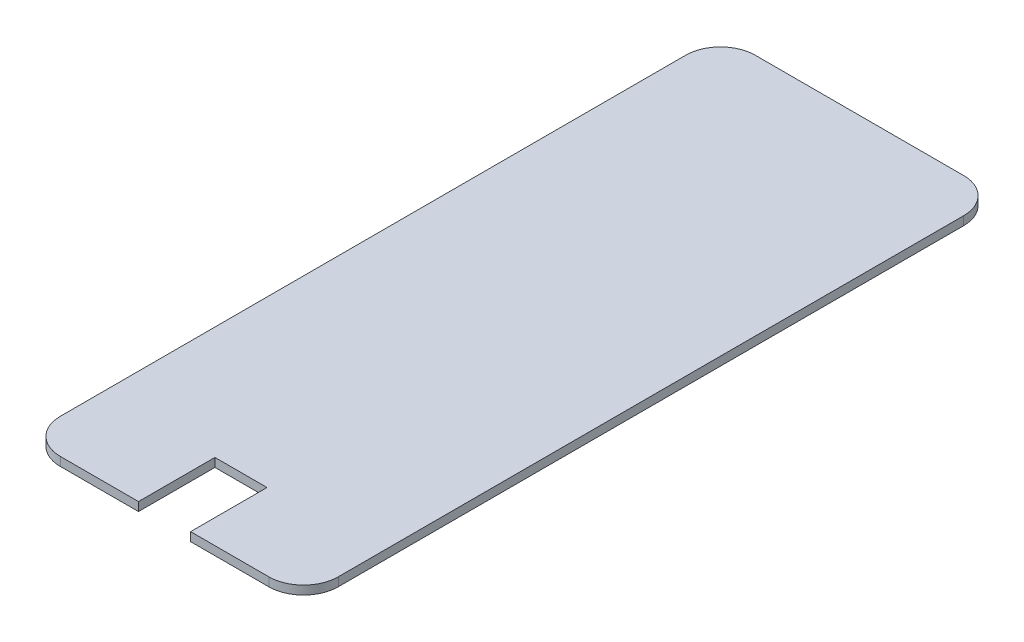
ISO-10303-21;
HEADER;
FILE_DESCRIPTION(('STEP AP214'),'2;1');
FILE_NAME('part.step','',(''),(''),'','','');
FILE_SCHEMA(('AUTOMOTIVE_DESIGN { 1 0 10303 214 1 1 1 1 }'));
ENDSEC;
DATA;
#1=APPLICATION_CONTEXT('core data for automotive mechanical design processes');
#2=APPLICATION_PROTOCOL_DEFINITION('international standard','automotive_design',2000,#1);
#3=PRODUCT_CONTEXT('',#1,'mechanical');
#4=PRODUCT('Part','Part','',(#3));
#5=PRODUCT_RELATED_PRODUCT_CATEGORY('part','',(#4));
#6=PRODUCT_DEFINITION_FORMATION('','',#4);
#7=PRODUCT_DEFINITION_CONTEXT('part definition',#1,'design');
#8=PRODUCT_DEFINITION('design','',#6,#7);
#9=PRODUCT_DEFINITION_SHAPE('','',#8);
#10=(LENGTH_UNIT() NAMED_UNIT(*) SI_UNIT(.MILLI.,.METRE.));
#11=(NAMED_UNIT(*) PLANE_ANGLE_UNIT() SI_UNIT($,.RADIAN.));
#12=(NAMED_UNIT(*) SI_UNIT($,.STERADIAN.) SOLID_ANGLE_UNIT());
#13=UNCERTAINTY_MEASURE_WITH_UNIT(LENGTH_MEASURE(1.E-05),#10,'distance_accuracy_value','');
#14=(GEOMETRIC_REPRESENTATION_CONTEXT(3) GLOBAL_UNCERTAINTY_ASSIGNED_CONTEXT((#13)) GLOBAL_UNIT_ASSIGNED_CONTEXT((#10,
#11,#12)) REPRESENTATION_CONTEXT('',''));
#15=CARTESIAN_POINT('',(0.,0.,0.));
#16=DIRECTION('',(0.,0.,1.));
#17=DIRECTION('',(1.,0.,0.));
#18=AXIS2_PLACEMENT_3D('',#15,#16,#17);
#19=CARTESIAN_POINT('',(-50.8,3.175,127.));
#20=DIRECTION('',(0.,0.,-1.));
#21=DIRECTION('',(-1.,0.,0.));
#22=AXIS2_PLACEMENT_3D('',#19,#20,#21);
#23=PLANE('',#22);
#24=DIRECTION('',(1.,0.,0.));
#25=VECTOR('',#24,1.);
#26=CARTESIAN_POINT('',(-50.8,3.175,127.));
#27=LINE('',#26,#25);
#28=CARTESIAN_POINT('',(9.525,3.175,127.));
#29=VERTEX_POINT('',#28);
#30=CARTESIAN_POINT('',(38.1,3.175,127.));
#31=VERTEX_POINT('',#30);
#32=EDGE_CURVE('E163',#29,#31,#27,.T.);
#33=ORIENTED_EDGE('',*,*,#32,.F.);
#34=DIRECTION('',(0.,1.,0.));
#35=VECTOR('',#34,1.);
#36=CARTESIAN_POINT('',(9.525,0.,127.));
#37=LINE('',#36,#35);
#38=CARTESIAN_POINT('',(9.525,0.,127.));
#39=VERTEX_POINT('',#38);
#40=EDGE_CURVE('E153',#39,#29,#37,.T.);
#41=ORIENTED_EDGE('',*,*,#40,.F.);
#42=DIRECTION('',(1.,0.,0.));
#43=VECTOR('',#42,1.);
#44=CARTESIAN_POINT('',(-50.8,0.,127.));
#45=LINE('',#44,#43);
#46=CARTESIAN_POINT('',(38.1,0.,127.));
#47=VERTEX_POINT('',#46);
#48=EDGE_CURVE('E144',#39,#47,#45,.T.);
#49=ORIENTED_EDGE('',*,*,#48,.T.);
#50=DIRECTION('',(0.,-1.,0.));
#51=VECTOR('',#50,1.);
#52=CARTESIAN_POINT('',(38.1,3.175,127.));
#53=LINE('',#52,#51);
#54=EDGE_CURVE('E173',#47,#31,#53,.F.);
#55=ORIENTED_EDGE('',*,*,#54,.T.);
#56=EDGE_LOOP('',(#33,#41,#49,#55));
#57=FACE_BOUND('',#56,.T.);
#58=ADVANCED_FACE('F34',(#57),#23,.F.);
#59=CARTESIAN_POINT('',(-50.8,3.175,-127.));
#60=DIRECTION('',(1.,0.,0.));
#61=DIRECTION('',(0.,0.,-1.));
#62=AXIS2_PLACEMENT_3D('',#59,#60,#61);
#63=PLANE('',#62);
#64=DIRECTION('',(0.,0.,1.));
#65=VECTOR('',#64,1.);
#66=CARTESIAN_POINT('',(-50.8,0.,-127.));
#67=LINE('',#66,#65);
#68=CARTESIAN_POINT('',(-50.8,0.,-114.3));
#69=VERTEX_POINT('',#68);
#70=CARTESIAN_POINT('',(-50.8,0.,114.3));
#71=VERTEX_POINT('',#70);
#72=EDGE_CURVE('E155',#69,#71,#67,.T.);
#73=ORIENTED_EDGE('',*,*,#72,.T.);
#74=DIRECTION('',(0.,-1.,0.));
#75=VECTOR('',#74,1.);
#76=CARTESIAN_POINT('',(-50.8,3.175,114.3));
#77=LINE('',#76,#75);
#78=CARTESIAN_POINT('',(-50.8,3.175,114.3));
#79=VERTEX_POINT('',#78);
#80=EDGE_CURVE('E199',#71,#79,#77,.F.);
#81=ORIENTED_EDGE('',*,*,#80,.T.);
#82=DIRECTION('',(0.,0.,1.));
#83=VECTOR('',#82,1.);
#84=CARTESIAN_POINT('',(-50.8,3.175,-127.));
#85=LINE('',#84,#83);
#86=CARTESIAN_POINT('',(-50.8,3.175,-114.3));
#87=VERTEX_POINT('',#86);
#88=EDGE_CURVE('E160',#87,#79,#85,.T.);
#89=ORIENTED_EDGE('',*,*,#88,.F.);
#90=DIRECTION('',(0.,-1.,0.));
#91=VECTOR('',#90,1.);
#92=CARTESIAN_POINT('',(-50.8,3.175,-114.3));
#93=LINE('',#92,#91);
#94=EDGE_CURVE('E196',#87,#69,#93,.T.);
#95=ORIENTED_EDGE('',*,*,#94,.T.);
#96=EDGE_LOOP('',(#73,#81,#89,#95));
#97=FACE_BOUND('',#96,.T.);
#98=ADVANCED_FACE('F236',(#97),#63,.F.);
#99=CARTESIAN_POINT('',(-38.1,0.,127.));
#100=VERTEX_POINT('',#99);
#101=CARTESIAN_POINT('',(-9.525,0.,127.));
#102=VERTEX_POINT('',#101);
#103=EDGE_CURVE('E176',#100,#102,#45,.T.);
#104=ORIENTED_EDGE('',*,*,#103,.T.);
#105=DIRECTION('',(0.,1.,0.));
#106=VECTOR('',#105,1.);
#107=CARTESIAN_POINT('',(-9.525,0.,127.));
#108=LINE('',#107,#106);
#109=CARTESIAN_POINT('',(-9.525,3.175,127.));
#110=VERTEX_POINT('',#109);
#111=EDGE_CURVE('E156',#102,#110,#108,.T.);
#112=ORIENTED_EDGE('',*,*,#111,.T.);
#113=CARTESIAN_POINT('',(-38.1,3.175,127.));
#114=VERTEX_POINT('',#113);
#115=EDGE_CURVE('E165',#114,#110,#27,.T.);
#116=ORIENTED_EDGE('',*,*,#115,.F.);
#117=DIRECTION('',(0.,-1.,0.));
#118=VECTOR('',#117,1.);
#119=CARTESIAN_POINT('',(-38.1,3.175,127.));
#120=LINE('',#119,#118);
#121=EDGE_CURVE('E185',#114,#100,#120,.T.);
#122=ORIENTED_EDGE('',*,*,#121,.T.);
#123=EDGE_LOOP('',(#104,#112,#116,#122));
#124=FACE_BOUND('',#123,.T.);
#125=ADVANCED_FACE('F245',(#124),#23,.F.);
#126=CARTESIAN_POINT('',(50.8,3.175,-127.));
#127=DIRECTION('',(-1.,0.,0.));
#128=DIRECTION('',(0.,0.,1.));
#129=AXIS2_PLACEMENT_3D('',#126,#127,#128);
#130=PLANE('',#129);
#131=DIRECTION('',(0.,0.,-1.));
#132=VECTOR('',#131,1.);
#133=CARTESIAN_POINT('',(50.8,3.175,-127.));
#134=LINE('',#133,#132);
#135=CARTESIAN_POINT('',(50.8,3.175,114.3));
#136=VERTEX_POINT('',#135);
#137=CARTESIAN_POINT('',(50.8,3.175,-114.3));
#138=VERTEX_POINT('',#137);
#139=EDGE_CURVE('E168',#136,#138,#134,.T.);
#140=ORIENTED_EDGE('',*,*,#139,.F.);
#141=DIRECTION('',(0.,-1.,0.));
#142=VECTOR('',#141,1.);
#143=CARTESIAN_POINT('',(50.8,3.175,114.3));
#144=LINE('',#143,#142);
#145=CARTESIAN_POINT('',(50.8,0.,114.3));
#146=VERTEX_POINT('',#145);
#147=EDGE_CURVE('E211',#136,#146,#144,.T.);
#148=ORIENTED_EDGE('',*,*,#147,.T.);
#149=DIRECTION('',(0.,0.,-1.));
#150=VECTOR('',#149,1.);
#151=CARTESIAN_POINT('',(50.8,0.,-127.));
#152=LINE('',#151,#150);
#153=CARTESIAN_POINT('',(50.8,0.,-114.3));
#154=VERTEX_POINT('',#153);
#155=EDGE_CURVE('E179',#146,#154,#152,.T.);
#156=ORIENTED_EDGE('',*,*,#155,.T.);
#157=DIRECTION('',(0.,-1.,0.));
#158=VECTOR('',#157,1.);
#159=CARTESIAN_POINT('',(50.8,3.175,-114.3));
#160=LINE('',#159,#158);
#161=EDGE_CURVE('E209',#154,#138,#160,.F.);
#162=ORIENTED_EDGE('',*,*,#161,.T.);
#163=EDGE_LOOP('',(#140,#148,#156,#162));
#164=FACE_BOUND('',#163,.T.);
#165=ADVANCED_FACE('F217',(#164),#130,.F.);
#166=CARTESIAN_POINT('',(-50.8,3.175,-127.));
#167=DIRECTION('',(0.,0.,1.));
#168=DIRECTION('',(1.,0.,0.));
#169=AXIS2_PLACEMENT_3D('',#166,#167,#168);
#170=PLANE('',#169);
#171=DIRECTION('',(-1.,0.,0.));
#172=VECTOR('',#171,1.);
#173=CARTESIAN_POINT('',(-50.8,3.175,-127.));
#174=LINE('',#173,#172);
#175=CARTESIAN_POINT('',(38.1,3.175,-127.));
#176=VERTEX_POINT('',#175);
#177=CARTESIAN_POINT('',(-38.1,3.175,-127.));
#178=VERTEX_POINT('',#177);
#179=EDGE_CURVE('E171',#176,#178,#174,.T.);
#180=ORIENTED_EDGE('',*,*,#179,.F.);
#181=DIRECTION('',(0.,-1.,0.));
#182=VECTOR('',#181,1.);
#183=CARTESIAN_POINT('',(38.1,3.175,-127.));
#184=LINE('',#183,#182);
#185=CARTESIAN_POINT('',(38.1,0.,-127.));
#186=VERTEX_POINT('',#185);
#187=EDGE_CURVE('E11',#176,#186,#184,.T.);
#188=ORIENTED_EDGE('',*,*,#187,.T.);
#189=DIRECTION('',(-1.,0.,0.));
#190=VECTOR('',#189,1.);
#191=CARTESIAN_POINT('',(-50.8,0.,-127.));
#192=LINE('',#191,#190);
#193=CARTESIAN_POINT('',(-38.1,0.,-127.));
#194=VERTEX_POINT('',#193);
#195=EDGE_CURVE('E164',#186,#194,#192,.T.);
#196=ORIENTED_EDGE('',*,*,#195,.T.);
#197=DIRECTION('',(0.,-1.,0.));
#198=VECTOR('',#197,1.);
#199=CARTESIAN_POINT('',(-38.1,3.175,-127.));
#200=LINE('',#199,#198);
#201=EDGE_CURVE('E42',#194,#178,#200,.F.);
#202=ORIENTED_EDGE('',*,*,#201,.T.);
#203=EDGE_LOOP('',(#180,#188,#196,#202));
#204=FACE_BOUND('',#203,.T.);
#205=ADVANCED_FACE('F227',(#204),#170,.F.);
#206=CARTESIAN_POINT('',(0.,3.175,0.));
#207=DIRECTION('',(0.,1.,0.));
#208=DIRECTION('',(0.,0.,1.));
#209=AXIS2_PLACEMENT_3D('',#206,#207,#208);
#210=PLANE('',#209);
#211=DIRECTION('',(0.,0.,-1.));
#212=VECTOR('',#211,1.);
#213=CARTESIAN_POINT('',(9.525,3.175,99.06));
#214=LINE('',#213,#212);
#215=CARTESIAN_POINT('',(9.525,3.175,99.06));
#216=VERTEX_POINT('',#215);
#217=EDGE_CURVE('E130',#29,#216,#214,.T.);
#218=ORIENTED_EDGE('',*,*,#217,.F.);
#219=ORIENTED_EDGE('',*,*,#32,.T.);
#220=CARTESIAN_POINT('',(38.1,3.175,114.3));
#221=DIRECTION('',(0.,1.,0.));
#222=DIRECTION('',(0.,0.,1.));
#223=AXIS2_PLACEMENT_3D('',#220,#221,#222);
#224=CIRCLE('',#223,12.7);
#225=EDGE_CURVE('E205',#31,#136,#224,.T.);
#226=ORIENTED_EDGE('',*,*,#225,.T.);
#227=ORIENTED_EDGE('',*,*,#139,.T.);
#228=CARTESIAN_POINT('',(38.1,3.175,-114.3));
#229=DIRECTION('',(0.,1.,0.));
#230=DIRECTION('',(0.,0.,1.));
#231=AXIS2_PLACEMENT_3D('',#228,#229,#230);
#232=CIRCLE('',#231,12.7);
#233=EDGE_CURVE('E203',#138,#176,#232,.T.);
#234=ORIENTED_EDGE('',*,*,#233,.T.);
#235=ORIENTED_EDGE('',*,*,#179,.T.);
#236=CARTESIAN_POINT('',(-38.1,3.175,-114.3));
#237=DIRECTION('',(0.,1.,0.));
#238=DIRECTION('',(0.,0.,1.));
#239=AXIS2_PLACEMENT_3D('',#236,#237,#238);
#240=CIRCLE('',#239,12.7);
#241=EDGE_CURVE('E201',#178,#87,#240,.T.);
#242=ORIENTED_EDGE('',*,*,#241,.T.);
#243=ORIENTED_EDGE('',*,*,#88,.T.);
#244=CARTESIAN_POINT('',(-38.1,3.175,114.3));
#245=DIRECTION('',(0.,1.,0.));
#246=DIRECTION('',(0.,0.,1.));
#247=AXIS2_PLACEMENT_3D('',#244,#245,#246);
#248=CIRCLE('',#247,12.7);
#249=EDGE_CURVE('E207',#79,#114,#248,.T.);
#250=ORIENTED_EDGE('',*,*,#249,.T.);
#251=ORIENTED_EDGE('',*,*,#115,.T.);
#252=DIRECTION('',(0.,0.,1.));
#253=VECTOR('',#252,1.);
#254=CARTESIAN_POINT('',(-9.525,3.175,99.06));
#255=LINE('',#254,#253);
#256=CARTESIAN_POINT('',(-9.525,3.175,99.06));
#257=VERTEX_POINT('',#256);
#258=EDGE_CURVE('E145',#257,#110,#255,.T.);
#259=ORIENTED_EDGE('',*,*,#258,.F.);
#260=DIRECTION('',(-1.,0.,0.));
#261=VECTOR('',#260,1.);
#262=CARTESIAN_POINT('',(-9.525,3.175,99.06));
#263=LINE('',#262,#261);
#264=EDGE_CURVE('E147',#216,#257,#263,.T.);
#265=ORIENTED_EDGE('',*,*,#264,.F.);
#266=EDGE_LOOP('',(#218,#219,#226,#227,#234,#235,#242,#243,#250,#251,#259,#265));
#267=FACE_BOUND('',#266,.T.);
#268=ADVANCED_FACE('F230',(#267),#210,.T.);
#269=CARTESIAN_POINT('',(0.,0.,0.));
#270=DIRECTION('',(0.,1.,0.));
#271=DIRECTION('',(0.,0.,1.));
#272=AXIS2_PLACEMENT_3D('',#269,#270,#271);
#273=PLANE('',#272);
#274=ORIENTED_EDGE('',*,*,#48,.F.);
#275=DIRECTION('',(0.,0.,-1.));
#276=VECTOR('',#275,1.);
#277=CARTESIAN_POINT('',(9.525,0.,99.06));
#278=LINE('',#277,#276);
#279=CARTESIAN_POINT('',(9.525,0.,99.06));
#280=VERTEX_POINT('',#279);
#281=EDGE_CURVE('E127',#39,#280,#278,.T.);
#282=ORIENTED_EDGE('',*,*,#281,.T.);
#283=DIRECTION('',(-1.,0.,0.));
#284=VECTOR('',#283,1.);
#285=CARTESIAN_POINT('',(-9.525,0.,99.06));
#286=LINE('',#285,#284);
#287=CARTESIAN_POINT('',(-9.525,0.,99.06));
#288=VERTEX_POINT('',#287);
#289=EDGE_CURVE('E137',#280,#288,#286,.T.);
#290=ORIENTED_EDGE('',*,*,#289,.T.);
#291=DIRECTION('',(0.,0.,1.));
#292=VECTOR('',#291,1.);
#293=CARTESIAN_POINT('',(-9.525,0.,99.06));
#294=LINE('',#293,#292);
#295=EDGE_CURVE('E49',#288,#102,#294,.T.);
#296=ORIENTED_EDGE('',*,*,#295,.T.);
#297=ORIENTED_EDGE('',*,*,#103,.F.);
#298=CARTESIAN_POINT('',(-38.1,0.,114.3));
#299=DIRECTION('',(0.,1.,0.));
#300=DIRECTION('',(0.,0.,1.));
#301=AXIS2_PLACEMENT_3D('',#298,#299,#300);
#302=CIRCLE('',#301,12.7);
#303=EDGE_CURVE('E194',#100,#71,#302,.F.);
#304=ORIENTED_EDGE('',*,*,#303,.T.);
#305=ORIENTED_EDGE('',*,*,#72,.F.);
#306=CARTESIAN_POINT('',(-38.1,0.,-114.3));
#307=DIRECTION('',(0.,1.,0.));
#308=DIRECTION('',(0.,0.,1.));
#309=AXIS2_PLACEMENT_3D('',#306,#307,#308);
#310=CIRCLE('',#309,12.7);
#311=EDGE_CURVE('E188',#69,#194,#310,.F.);
#312=ORIENTED_EDGE('',*,*,#311,.T.);
#313=ORIENTED_EDGE('',*,*,#195,.F.);
#314=CARTESIAN_POINT('',(38.1,0.,-114.3));
#315=DIRECTION('',(0.,1.,0.));
#316=DIRECTION('',(0.,0.,1.));
#317=AXIS2_PLACEMENT_3D('',#314,#315,#316);
#318=CIRCLE('',#317,12.7);
#319=EDGE_CURVE('E190',#186,#154,#318,.F.);
#320=ORIENTED_EDGE('',*,*,#319,.T.);
#321=ORIENTED_EDGE('',*,*,#155,.F.);
#322=CARTESIAN_POINT('',(38.1,0.,114.3));
#323=DIRECTION('',(0.,1.,0.));
#324=DIRECTION('',(0.,0.,1.));
#325=AXIS2_PLACEMENT_3D('',#322,#323,#324);
#326=CIRCLE('',#325,12.7);
#327=EDGE_CURVE('E192',#146,#47,#326,.F.);
#328=ORIENTED_EDGE('',*,*,#327,.T.);
#329=EDGE_LOOP('',(#274,#282,#290,#296,#297,#304,#305,#312,#313,#320,#321,#328));
#330=FACE_BOUND('',#329,.T.);
#331=ADVANCED_FACE('F142',(#330),#273,.F.);
#332=CARTESIAN_POINT('',(-38.1,3.175,114.3));
#333=DIRECTION('',(0.,-1.,0.));
#334=DIRECTION('',(0.,0.,-1.));
#335=AXIS2_PLACEMENT_3D('',#332,#333,#334);
#336=CYLINDRICAL_SURFACE('',#335,12.7);
#337=ORIENTED_EDGE('',*,*,#249,.F.);
#338=ORIENTED_EDGE('',*,*,#80,.F.);
#339=ORIENTED_EDGE('',*,*,#303,.F.);
#340=ORIENTED_EDGE('',*,*,#121,.F.);
#341=EDGE_LOOP('',(#337,#338,#339,#340));
#342=FACE_BOUND('',#341,.T.);
#343=ADVANCED_FACE('F242',(#342),#336,.T.);
#344=CARTESIAN_POINT('',(38.1,3.175,114.3));
#345=DIRECTION('',(0.,-1.,0.));
#346=DIRECTION('',(0.,0.,-1.));
#347=AXIS2_PLACEMENT_3D('',#344,#345,#346);
#348=CYLINDRICAL_SURFACE('',#347,12.7);
#349=ORIENTED_EDGE('',*,*,#225,.F.);
#350=ORIENTED_EDGE('',*,*,#54,.F.);
#351=ORIENTED_EDGE('',*,*,#327,.F.);
#352=ORIENTED_EDGE('',*,*,#147,.F.);
#353=EDGE_LOOP('',(#349,#350,#351,#352));
#354=FACE_BOUND('',#353,.T.);
#355=ADVANCED_FACE('F315',(#354),#348,.T.);
#356=CARTESIAN_POINT('',(38.1,3.175,-114.3));
#357=DIRECTION('',(0.,-1.,0.));
#358=DIRECTION('',(0.,0.,-1.));
#359=AXIS2_PLACEMENT_3D('',#356,#357,#358);
#360=CYLINDRICAL_SURFACE('',#359,12.7);
#361=ORIENTED_EDGE('',*,*,#233,.F.);
#362=ORIENTED_EDGE('',*,*,#161,.F.);
#363=ORIENTED_EDGE('',*,*,#319,.F.);
#364=ORIENTED_EDGE('',*,*,#187,.F.);
#365=EDGE_LOOP('',(#361,#362,#363,#364));
#366=FACE_BOUND('',#365,.T.);
#367=ADVANCED_FACE('F226',(#366),#360,.T.);
#368=CARTESIAN_POINT('',(-38.1,3.175,-114.3));
#369=DIRECTION('',(0.,-1.,0.));
#370=DIRECTION('',(0.,0.,-1.));
#371=AXIS2_PLACEMENT_3D('',#368,#369,#370);
#372=CYLINDRICAL_SURFACE('',#371,12.7);
#373=ORIENTED_EDGE('',*,*,#241,.F.);
#374=ORIENTED_EDGE('',*,*,#201,.F.);
#375=ORIENTED_EDGE('',*,*,#311,.F.);
#376=ORIENTED_EDGE('',*,*,#94,.F.);
#377=EDGE_LOOP('',(#373,#374,#375,#376));
#378=FACE_BOUND('',#377,.T.);
#379=ADVANCED_FACE('F36',(#378),#372,.T.);
#380=CARTESIAN_POINT('',(9.525,0.,99.06));
#381=DIRECTION('',(1.,0.,0.));
#382=DIRECTION('',(0.,0.,-1.));
#383=AXIS2_PLACEMENT_3D('',#380,#381,#382);
#384=PLANE('',#383);
#385=ORIENTED_EDGE('',*,*,#217,.T.);
#386=DIRECTION('',(0.,1.,0.));
#387=VECTOR('',#386,1.);
#388=CARTESIAN_POINT('',(9.525,0.,99.06));
#389=LINE('',#388,#387);
#390=EDGE_CURVE('E123',#280,#216,#389,.T.);
#391=ORIENTED_EDGE('',*,*,#390,.F.);
#392=ORIENTED_EDGE('',*,*,#281,.F.);
#393=ORIENTED_EDGE('',*,*,#40,.T.);
#394=EDGE_LOOP('',(#385,#391,#392,#393));
#395=FACE_BOUND('',#394,.T.);
#396=ADVANCED_FACE('F125',(#395),#384,.F.);
#397=CARTESIAN_POINT('',(-9.525,0.,99.06));
#398=DIRECTION('',(-1.,0.,0.));
#399=DIRECTION('',(0.,0.,1.));
#400=AXIS2_PLACEMENT_3D('',#397,#398,#399);
#401=PLANE('',#400);
#402=ORIENTED_EDGE('',*,*,#258,.T.);
#403=ORIENTED_EDGE('',*,*,#111,.F.);
#404=ORIENTED_EDGE('',*,*,#295,.F.);
#405=DIRECTION('',(0.,1.,0.));
#406=VECTOR('',#405,1.);
#407=CARTESIAN_POINT('',(-9.525,0.,99.06));
#408=LINE('',#407,#406);
#409=EDGE_CURVE('E134',#288,#257,#408,.T.);
#410=ORIENTED_EDGE('',*,*,#409,.T.);
#411=EDGE_LOOP('',(#402,#403,#404,#410));
#412=FACE_BOUND('',#411,.T.);
#413=ADVANCED_FACE('F247',(#412),#401,.F.);
#414=CARTESIAN_POINT('',(-9.525,0.,99.06));
#415=DIRECTION('',(0.,0.,-1.));
#416=DIRECTION('',(-1.,0.,0.));
#417=AXIS2_PLACEMENT_3D('',#414,#415,#416);
#418=PLANE('',#417);
#419=ORIENTED_EDGE('',*,*,#264,.T.);
#420=ORIENTED_EDGE('',*,*,#409,.F.);
#421=ORIENTED_EDGE('',*,*,#289,.F.);
#422=ORIENTED_EDGE('',*,*,#390,.T.);
#423=EDGE_LOOP('',(#419,#420,#421,#422));
#424=FACE_BOUND('',#423,.T.);
#425=ADVANCED_FACE('F138',(#424),#418,.F.);
#426=CLOSED_SHELL('',(#58,#98,#125,#165,#205,#268,#331,#343,#355,#367,#379,#396,#413,#425));
#427=MANIFOLD_SOLID_BREP('B2',#426);
#428=ADVANCED_BREP_SHAPE_REPRESENTATION('',(#18,#427),#14);
#429=SHAPE_DEFINITION_REPRESENTATION(#9,#428);
ENDSEC;
END-ISO-10303-21;
